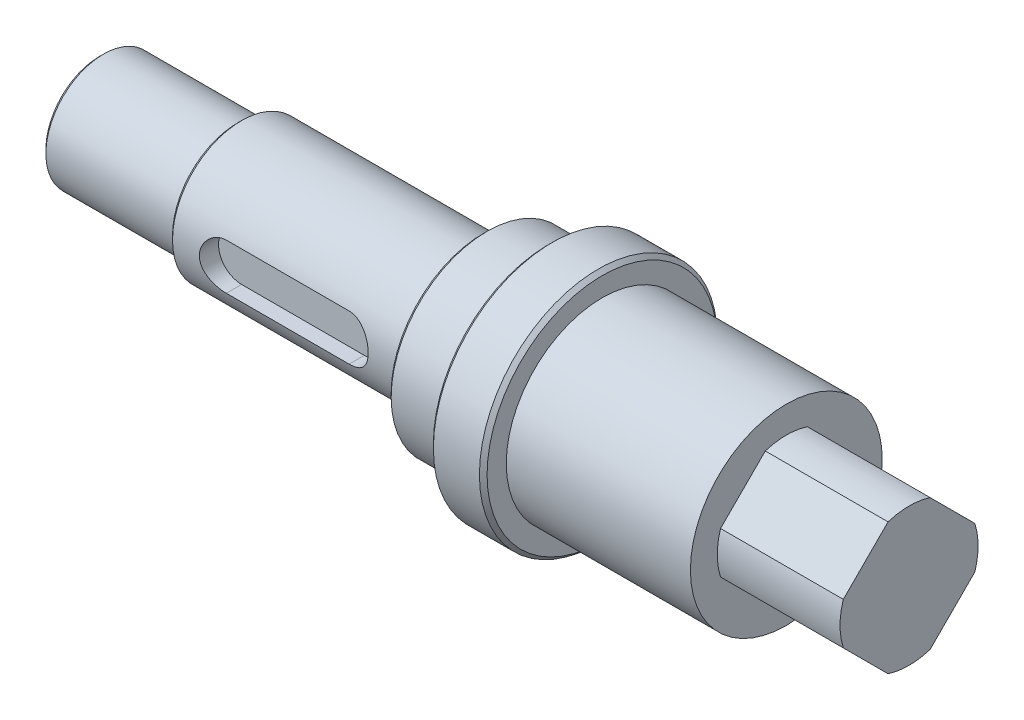
ISO-10303-21;
HEADER;
FILE_DESCRIPTION(('STEP AP214'),'2;1');
FILE_NAME('part.step','',(''),(''),'','','');
FILE_SCHEMA(('AUTOMOTIVE_DESIGN { 1 0 10303 214 1 1 1 1 }'));
ENDSEC;
DATA;
#1=APPLICATION_CONTEXT('core data for automotive mechanical design processes');
#2=APPLICATION_PROTOCOL_DEFINITION('international standard','automotive_design',2000,#1);
#3=PRODUCT_CONTEXT('',#1,'mechanical');
#4=PRODUCT('Part','Part','',(#3));
#5=PRODUCT_RELATED_PRODUCT_CATEGORY('part','',(#4));
#6=PRODUCT_DEFINITION_FORMATION('','',#4);
#7=PRODUCT_DEFINITION_CONTEXT('part definition',#1,'design');
#8=PRODUCT_DEFINITION('design','',#6,#7);
#9=PRODUCT_DEFINITION_SHAPE('','',#8);
#10=(LENGTH_UNIT() NAMED_UNIT(*) SI_UNIT(.MILLI.,.METRE.));
#11=(NAMED_UNIT(*) PLANE_ANGLE_UNIT() SI_UNIT($,.RADIAN.));
#12=(NAMED_UNIT(*) SI_UNIT($,.STERADIAN.) SOLID_ANGLE_UNIT());
#13=UNCERTAINTY_MEASURE_WITH_UNIT(LENGTH_MEASURE(1.E-05),#10,'distance_accuracy_value','');
#14=(GEOMETRIC_REPRESENTATION_CONTEXT(3) GLOBAL_UNCERTAINTY_ASSIGNED_CONTEXT((#13)) GLOBAL_UNIT_ASSIGNED_CONTEXT((#10,
#11,#12)) REPRESENTATION_CONTEXT('',''));
#15=CARTESIAN_POINT('',(0.,0.,0.));
#16=DIRECTION('',(0.,0.,1.));
#17=DIRECTION('',(1.,0.,0.));
#18=AXIS2_PLACEMENT_3D('',#15,#16,#17);
#19=CARTESIAN_POINT('',(-71.5,0.,0.));
#20=DIRECTION('',(1.,0.,0.));
#21=DIRECTION('',(0.,0.,-1.));
#22=AXIS2_PLACEMENT_3D('',#19,#20,#21);
#23=CYLINDRICAL_SURFACE('',#22,9.);
#24=CARTESIAN_POINT('',(-39.5,0.,0.));
#25=DIRECTION('',(-1.,0.,0.));
#26=DIRECTION('',(0.,0.,1.));
#27=AXIS2_PLACEMENT_3D('',#24,#25,#26);
#28=CIRCLE('',#27,9.);
#29=CARTESIAN_POINT('',(-39.5,0.,9.));
#30=VERTEX_POINT('',#29);
#31=EDGE_CURVE('E120',#30,#30,#28,.T.);
#32=ORIENTED_EDGE('',*,*,#31,.T.);
#33=EDGE_LOOP('',(#32));
#34=FACE_BOUND('',#33,.T.);
#35=CARTESIAN_POINT('',(-71.,0.,0.));
#36=DIRECTION('',(-1.,0.,0.));
#37=DIRECTION('',(0.,0.,1.));
#38=AXIS2_PLACEMENT_3D('',#35,#36,#37);
#39=CIRCLE('',#38,9.);
#40=CARTESIAN_POINT('',(-71.,0.,9.));
#41=VERTEX_POINT('',#40);
#42=EDGE_CURVE('E227',#41,#41,#39,.F.);
#43=ORIENTED_EDGE('',*,*,#42,.T.);
#44=EDGE_LOOP('',(#43));
#45=FACE_BOUND('',#44,.T.);
#46=CARTESIAN_POINT('',(-64.5,3.,8.48528137423857));
#47=CARTESIAN_POINT('',(-64.5818484933844,3.00001078932486,8.48526831927789));
#48=CARTESIAN_POINT('',(-64.6636896896105,2.99665064665902,8.48646532685483));
#49=CARTESIAN_POINT('',(-64.8267372460191,2.98327254936565,8.49118228945209));
#50=CARTESIAN_POINT('',(-64.9079437715857,2.97325639196642,8.49470161740771));
#51=CARTESIAN_POINT('',(-65.0689085860255,2.94668951307354,8.50395246303008));
#52=CARTESIAN_POINT('',(-65.148670443061,2.93015817315761,8.50967741820142));
#53=CARTESIAN_POINT('',(-65.3064099222994,2.89073017236144,8.52315143887203));
#54=CARTESIAN_POINT('',(-65.384387479908,2.86783328143241,8.53090057752397));
#55=CARTESIAN_POINT('',(-65.6147538956573,2.78989861567431,8.55683928952694));
#56=CARTESIAN_POINT('',(-65.7638149889627,2.72557700172275,8.5777349266086));
#57=CARTESIAN_POINT('',(-66.0490521737574,2.57421340927528,8.62436440905027));
#58=CARTESIAN_POINT('',(-66.1852202829412,2.4871574792233,8.65010122261301));
#59=CARTESIAN_POINT('',(-66.4461514841598,2.28915595016086,8.70463418867364));
#60=CARTESIAN_POINT('',(-66.5703421713023,2.17747541556633,8.73350627313643));
#61=CARTESIAN_POINT('',(-66.7986205239,1.93496485428978,8.79041552071284));
#62=CARTESIAN_POINT('',(-66.9027046096561,1.80413142497752,8.81845253440363));
#63=CARTESIAN_POINT('',(-67.0904378690398,1.52281106991368,8.87141647315469));
#64=CARTESIAN_POINT('',(-67.1734827690068,1.3719003033607,8.8962431223892));
#65=CARTESIAN_POINT('',(-67.3127769392054,1.05728771462316,8.9390882626048));
#66=CARTESIAN_POINT('',(-67.3690343949708,0.893589817668319,8.95710883299482));
#67=CARTESIAN_POINT('',(-67.4512071304867,0.564088045229084,8.98377213313373));
#68=CARTESIAN_POINT('',(-67.4781098013917,0.398555505085338,8.99271926928151));
#69=CARTESIAN_POINT('',(-67.5039489118423,0.0650969066624217,9.0013082524901));
#70=CARTESIAN_POINT('',(-67.5028920150987,-0.10282857176297,9.00095231678789));
#71=CARTESIAN_POINT('',(-67.4734671340687,-0.429311537733988,8.99118115872284));
#72=CARTESIAN_POINT('',(-67.4461720359939,-0.587978116884624,8.98212182877037));
#73=CARTESIAN_POINT('',(-67.3668204541081,-0.898332184121464,8.9564088159923));
#74=CARTESIAN_POINT('',(-67.3147625972955,-1.05001928471038,8.93975471206725));
#75=CARTESIAN_POINT('',(-67.1867357048648,-1.34445790368093,8.90027004455731));
#76=CARTESIAN_POINT('',(-67.1104611658558,-1.48706564697703,8.8773611217211));
#77=CARTESIAN_POINT('',(-66.9364208447953,-1.757773637242,8.82775164383326));
#78=CARTESIAN_POINT('',(-66.838649216676,-1.88586992347829,8.80105005807908));
#79=CARTESIAN_POINT('',(-66.6189841175417,-2.13029252762403,8.74518810577395));
#80=CARTESIAN_POINT('',(-66.4961729486757,-2.24578277403271,8.7159711601532));
#81=CARTESIAN_POINT('',(-66.2326859547076,-2.45481413464107,8.65942491449436));
#82=CARTESIAN_POINT('',(-66.0920043807076,-2.54834815783839,8.63209622629495));
#83=CARTESIAN_POINT('',(-65.7939199217636,-2.71201733554396,8.58210018141277));
#84=CARTESIAN_POINT('',(-65.6363008488814,-2.78178668333576,8.55950759277136));
#85=CARTESIAN_POINT('',(-65.3923158654452,-2.86551808116445,8.5316849132946));
#86=CARTESIAN_POINT('',(-65.3097432429298,-2.889939000529,8.52342263559069));
#87=CARTESIAN_POINT('',(-65.1426296037896,-2.9316254907929,8.50917513666655));
#88=CARTESIAN_POINT('',(-65.0580895046639,-2.94889432902108,8.50318887578236));
#89=CARTESIAN_POINT('',(-64.8947667222494,-2.97496555991272,8.49410161473166));
#90=CARTESIAN_POINT('',(-64.8160871393639,-2.98435073218189,8.49080270505212));
#91=CARTESIAN_POINT('',(-64.6582744704951,-2.99686829404165,8.48638843638536));
#92=CARTESIAN_POINT('',(-64.5791421023582,-3.00000875209309,8.48527025982562));
#93=CARTESIAN_POINT('',(-64.5,-3.,8.48528137423857));
#94=B_SPLINE_CURVE_WITH_KNOTS('',3,(#46,#47,#48,#49,#50,#51,#52,#53,#54,#55,#56,#57,#58,#59,#60,
#61,#62,#63,#64,#65,#66,#67,#68,#69,#70,#71,#72,#73,#74,#75,#76,#77,#78,#79,#80,#81,#82,#83,#84,
#85,#86,#87,#88,#89,#90,#91,#92,#93),.UNSPECIFIED.,.F.,.F.,(4,2,2,2,2,2,2,2,2,2,2,2,2,2,2,2,2,2,
2,2,2,2,2,4),(0.,0.245455454206308,0.490844658508407,0.735509315314908,0.980182815366522,
1.46881220307908,1.95774215958631,2.4639343690607,2.97021661609279,3.48971320817339,
4.00905095381416,4.51032334200244,5.01147626109962,5.4929717741524,5.97449398742779,
6.46234978495937,6.95033841784336,7.46126084192182,7.9723480476576,8.49098011802156,
8.75020549988897,9.0093123272696,9.24695816264697,9.48429674853611),.UNSPECIFIED.);
#95=CARTESIAN_POINT('',(-64.5,3.,8.48528137423857));
#96=VERTEX_POINT('',#95);
#97=CARTESIAN_POINT('',(-64.5,-3.,8.48528137423857));
#98=VERTEX_POINT('',#97);
#99=EDGE_CURVE('E11',#96,#98,#94,.T.);
#100=ORIENTED_EDGE('',*,*,#99,.F.);
#101=DIRECTION('',(1.,0.,0.));
#102=VECTOR('',#101,1.);
#103=CARTESIAN_POINT('',(-71.5,3.,8.48528137423857));
#104=LINE('',#103,#102);
#105=CARTESIAN_POINT('',(-48.5,3.,8.48528137423857));
#106=VERTEX_POINT('',#105);
#107=EDGE_CURVE('E239',#106,#96,#104,.F.);
#108=ORIENTED_EDGE('',*,*,#107,.F.);
#109=CARTESIAN_POINT('',(-48.5,-3.,8.48528137423857));
#110=CARTESIAN_POINT('',(-48.4181515066156,-3.00001078932487,8.48526831927788));
#111=CARTESIAN_POINT('',(-48.3363103103895,-2.99665064665902,8.48646532685483));
#112=CARTESIAN_POINT('',(-48.1732627539809,-2.98327254936565,8.49118228945209));
#113=CARTESIAN_POINT('',(-48.0920562284144,-2.97325639196643,8.49470161740771));
#114=CARTESIAN_POINT('',(-47.9310914139746,-2.94668951307355,8.50395246303008));
#115=CARTESIAN_POINT('',(-47.851329556939,-2.93015817315763,8.50967741820142));
#116=CARTESIAN_POINT('',(-47.6935900777006,-2.89073017236145,8.52315143887203));
#117=CARTESIAN_POINT('',(-47.615612520092,-2.86783328143241,8.53090057752397));
#118=CARTESIAN_POINT('',(-47.3852461043427,-2.78989861567429,8.55683928952695));
#119=CARTESIAN_POINT('',(-47.2361850110373,-2.72557700172275,8.57773492660859));
#120=CARTESIAN_POINT('',(-46.9509478262426,-2.5742134092753,8.62436440905026));
#121=CARTESIAN_POINT('',(-46.8147797170588,-2.48715747922331,8.65010122261301));
#122=CARTESIAN_POINT('',(-46.5538485158402,-2.28915595016086,8.70463418867364));
#123=CARTESIAN_POINT('',(-46.4296578286977,-2.17747541556633,8.73350627313643));
#124=CARTESIAN_POINT('',(-46.2013794761,-1.93496485428978,8.79041552071283));
#125=CARTESIAN_POINT('',(-46.0972953903439,-1.80413142497752,8.81845253440363));
#126=CARTESIAN_POINT('',(-45.9095621309602,-1.52281106991368,8.87141647315469));
#127=CARTESIAN_POINT('',(-45.8265172309932,-1.37190030336069,8.8962431223892));
#128=CARTESIAN_POINT('',(-45.6872230607945,-1.05728771462316,8.9390882626048));
#129=CARTESIAN_POINT('',(-45.6309656050292,-0.893589817668317,8.95710883299482));
#130=CARTESIAN_POINT('',(-45.5487928695132,-0.564088045229085,8.98377213313373));
#131=CARTESIAN_POINT('',(-45.5218901986083,-0.398555505085339,8.99271926928151));
#132=CARTESIAN_POINT('',(-45.4960510881577,-0.0650969066624213,9.0013082524901));
#133=CARTESIAN_POINT('',(-45.4971079849013,0.10282857176297,9.00095231678789));
#134=CARTESIAN_POINT('',(-45.5265328659313,0.429311537733991,8.99118115872284));
#135=CARTESIAN_POINT('',(-45.5538279640061,0.587978116884628,8.98212182877037));
#136=CARTESIAN_POINT('',(-45.6331795458919,0.898332184121467,8.9564088159923));
#137=CARTESIAN_POINT('',(-45.6852374027045,1.05001928471038,8.93975471206725));
#138=CARTESIAN_POINT('',(-45.8132642951352,1.34445790368095,8.9002700445573));
#139=CARTESIAN_POINT('',(-45.8895388341442,1.48706564697705,8.87736112172109));
#140=CARTESIAN_POINT('',(-46.0635791552047,1.75777363724202,8.82775164383325));
#141=CARTESIAN_POINT('',(-46.1613507833241,1.88586992347829,8.80105005807908));
#142=CARTESIAN_POINT('',(-46.3810158824584,2.13029252762403,8.74518810577395));
#143=CARTESIAN_POINT('',(-46.5038270513244,2.24578277403273,8.71597116015319));
#144=CARTESIAN_POINT('',(-46.7673140452924,2.4548141346411,8.65942491449435));
#145=CARTESIAN_POINT('',(-46.9079956192924,2.5483481578384,8.63209622629495));
#146=CARTESIAN_POINT('',(-47.2060800782364,2.71201733554396,8.58210018141277));
#147=CARTESIAN_POINT('',(-47.3636991511186,2.78178668333575,8.55950759277136));
#148=CARTESIAN_POINT('',(-47.6076841345548,2.86551808116444,8.5316849132946));
#149=CARTESIAN_POINT('',(-47.6902567570702,2.88993900052899,8.52342263559069));
#150=CARTESIAN_POINT('',(-47.8573703962103,2.93162549079289,8.50917513666655));
#151=CARTESIAN_POINT('',(-47.941910495336,2.94889432902107,8.50318887578236));
#152=CARTESIAN_POINT('',(-48.1052332777506,2.97496555991272,8.49410161473166));
#153=CARTESIAN_POINT('',(-48.1839128606361,2.98435073218189,8.49080270505212));
#154=CARTESIAN_POINT('',(-48.3417255295049,2.99686829404165,8.48638843638536));
#155=CARTESIAN_POINT('',(-48.4208578976418,3.00000875209309,8.48527025982562));
#156=CARTESIAN_POINT('',(-48.5,3.,8.48528137423857));
#157=B_SPLINE_CURVE_WITH_KNOTS('',3,(#109,#110,#111,#112,#113,#114,#115,#116,#117,#118,#119,
#120,#121,#122,#123,#124,#125,#126,#127,#128,#129,#130,#131,#132,#133,#134,#135,#136,#137,#138,
#139,#140,#141,#142,#143,#144,#145,#146,#147,#148,#149,#150,#151,#152,#153,#154,#155,#156),
.UNSPECIFIED.,.F.,.F.,(4,2,2,2,2,2,2,2,2,2,2,2,2,2,2,2,2,2,2,2,2,2,2,4),(0.,0.245455454206287,
0.490844658508364,0.735509315314858,0.980182815366429,1.46881220307905,1.9577421595863,
2.46393436906069,2.97021661609278,3.48971320817339,4.00905095381416,4.51032334200243,
5.01147626109962,5.4929717741524,5.97449398742779,6.46234978495939,6.95033841784342,
7.46126084192184,7.97234804765758,8.49098011802151,8.75020549988893,9.00931232726957,
9.24695816264694,9.48429674853609),.UNSPECIFIED.);
#158=CARTESIAN_POINT('',(-48.5,-3.,8.48528137423857));
#159=VERTEX_POINT('',#158);
#160=EDGE_CURVE('E241',#159,#106,#157,.T.);
#161=ORIENTED_EDGE('',*,*,#160,.F.);
#162=DIRECTION('',(1.,0.,0.));
#163=VECTOR('',#162,1.);
#164=CARTESIAN_POINT('',(-71.5,-3.,8.48528137423857));
#165=LINE('',#164,#163);
#166=EDGE_CURVE('E31',#98,#159,#165,.T.);
#167=ORIENTED_EDGE('',*,*,#166,.F.);
#168=EDGE_LOOP('',(#100,#108,#161,#167));
#169=FACE_BOUND('',#168,.T.);
#170=ADVANCED_FACE('F17',(#34,#45,#169),#23,.T.);
#171=CARTESIAN_POINT('',(16.,0.,0.));
#172=DIRECTION('',(-1.,0.,0.));
#173=DIRECTION('',(0.,0.,1.));
#174=AXIS2_PLACEMENT_3D('',#171,#172,#173);
#175=CYLINDRICAL_SURFACE('',#174,9.);
#176=DIRECTION('',(-1.,0.,0.));
#177=VECTOR('',#176,1.);
#178=CARTESIAN_POINT('',(16.,2.74137830206974,-8.57233019691503));
#179=LINE('',#178,#177);
#180=CARTESIAN_POINT('',(16.,2.74137830206974,-8.57233019691503));
#181=VERTEX_POINT('',#180);
#182=CARTESIAN_POINT('',(0.,2.74137830206974,-8.57233019691503));
#183=VERTEX_POINT('',#182);
#184=EDGE_CURVE('E183',#181,#183,#179,.T.);
#185=ORIENTED_EDGE('',*,*,#184,.F.);
#186=CARTESIAN_POINT('',(16.,0.,0.));
#187=DIRECTION('',(1.,0.,0.));
#188=DIRECTION('',(0.,0.,-1.));
#189=AXIS2_PLACEMENT_3D('',#186,#187,#188);
#190=CIRCLE('',#189,9.);
#191=CARTESIAN_POINT('',(16.,-2.74137830206974,-8.57233019691502));
#192=VERTEX_POINT('',#191);
#193=EDGE_CURVE('E187',#192,#181,#190,.T.);
#194=ORIENTED_EDGE('',*,*,#193,.F.);
#195=DIRECTION('',(-1.,0.,0.));
#196=VECTOR('',#195,1.);
#197=CARTESIAN_POINT('',(16.,-2.74137830206974,-8.57233019691503));
#198=LINE('',#197,#196);
#199=CARTESIAN_POINT('',(0.,-2.74137830206974,-8.57233019691503));
#200=VERTEX_POINT('',#199);
#201=EDGE_CURVE('E176',#200,#192,#198,.F.);
#202=ORIENTED_EDGE('',*,*,#201,.F.);
#203=CARTESIAN_POINT('',(0.,0.,0.));
#204=DIRECTION('',(1.,0.,0.));
#205=DIRECTION('',(0.,0.,-1.));
#206=AXIS2_PLACEMENT_3D('',#203,#204,#205);
#207=CIRCLE('',#206,9.);
#208=EDGE_CURVE('E186',#200,#183,#207,.T.);
#209=ORIENTED_EDGE('',*,*,#208,.T.);
#210=EDGE_LOOP('',(#185,#194,#202,#209));
#211=FACE_BOUND('',#210,.T.);
#212=ADVANCED_FACE('F287',(#211),#175,.T.);
#213=DIRECTION('',(-1.,0.,0.));
#214=VECTOR('',#213,1.);
#215=CARTESIAN_POINT('',(16.,8.57233019691503,-2.74137830206974));
#216=LINE('',#215,#214);
#217=CARTESIAN_POINT('',(0.,8.57233019691503,-2.74137830206974));
#218=VERTEX_POINT('',#217);
#219=CARTESIAN_POINT('',(16.,8.57233019691503,-2.74137830206974));
#220=VERTEX_POINT('',#219);
#221=EDGE_CURVE('E181',#218,#220,#216,.F.);
#222=ORIENTED_EDGE('',*,*,#221,.F.);
#223=CARTESIAN_POINT('',(0.,8.57233019691503,2.74137830206974));
#224=VERTEX_POINT('',#223);
#225=EDGE_CURVE('E46',#218,#224,#207,.T.);
#226=ORIENTED_EDGE('',*,*,#225,.T.);
#227=DIRECTION('',(-1.,0.,0.));
#228=VECTOR('',#227,1.);
#229=CARTESIAN_POINT('',(16.,8.57233019691503,2.74137830206974));
#230=LINE('',#229,#228);
#231=CARTESIAN_POINT('',(16.,8.57233019691503,2.74137830206974));
#232=VERTEX_POINT('',#231);
#233=EDGE_CURVE('E168',#232,#224,#230,.T.);
#234=ORIENTED_EDGE('',*,*,#233,.F.);
#235=EDGE_CURVE('E191',#220,#232,#190,.T.);
#236=ORIENTED_EDGE('',*,*,#235,.F.);
#237=EDGE_LOOP('',(#222,#226,#234,#236));
#238=FACE_BOUND('',#237,.T.);
#239=ADVANCED_FACE('F293',(#238),#175,.T.);
#240=DIRECTION('',(-1.,0.,0.));
#241=VECTOR('',#240,1.);
#242=CARTESIAN_POINT('',(16.,-8.57233019691503,-2.74137830206974));
#243=LINE('',#242,#241);
#244=CARTESIAN_POINT('',(16.,-8.57233019691503,-2.74137830206974));
#245=VERTEX_POINT('',#244);
#246=CARTESIAN_POINT('',(0.,-8.57233019691503,-2.74137830206974));
#247=VERTEX_POINT('',#246);
#248=EDGE_CURVE('E178',#245,#247,#243,.T.);
#249=ORIENTED_EDGE('',*,*,#248,.F.);
#250=CARTESIAN_POINT('',(16.,-8.57233019691503,2.74137830206973));
#251=VERTEX_POINT('',#250);
#252=EDGE_CURVE('E190',#251,#245,#190,.T.);
#253=ORIENTED_EDGE('',*,*,#252,.F.);
#254=DIRECTION('',(-1.,0.,0.));
#255=VECTOR('',#254,1.);
#256=CARTESIAN_POINT('',(16.,-8.57233019691503,2.74137830206973));
#257=LINE('',#256,#255);
#258=CARTESIAN_POINT('',(0.,-8.57233019691503,2.74137830206973));
#259=VERTEX_POINT('',#258);
#260=EDGE_CURVE('E171',#259,#251,#257,.F.);
#261=ORIENTED_EDGE('',*,*,#260,.F.);
#262=EDGE_CURVE('E194',#259,#247,#207,.T.);
#263=ORIENTED_EDGE('',*,*,#262,.T.);
#264=EDGE_LOOP('',(#249,#253,#261,#263));
#265=FACE_BOUND('',#264,.T.);
#266=ADVANCED_FACE('F524',(#265),#175,.T.);
#267=DIRECTION('',(-1.,0.,0.));
#268=VECTOR('',#267,1.);
#269=CARTESIAN_POINT('',(16.,-2.74137830206974,8.57233019691503));
#270=LINE('',#269,#268);
#271=CARTESIAN_POINT('',(16.,-2.74137830206974,8.57233019691503));
#272=VERTEX_POINT('',#271);
#273=CARTESIAN_POINT('',(0.,-2.74137830206974,8.57233019691503));
#274=VERTEX_POINT('',#273);
#275=EDGE_CURVE('E173',#272,#274,#270,.T.);
#276=ORIENTED_EDGE('',*,*,#275,.F.);
#277=CARTESIAN_POINT('',(16.,2.74137830206974,8.57233019691503));
#278=VERTEX_POINT('',#277);
#279=EDGE_CURVE('E575',#278,#272,#190,.T.);
#280=ORIENTED_EDGE('',*,*,#279,.F.);
#281=DIRECTION('',(-1.,0.,0.));
#282=VECTOR('',#281,1.);
#283=CARTESIAN_POINT('',(16.,2.74137830206974,8.57233019691503));
#284=LINE('',#283,#282);
#285=CARTESIAN_POINT('',(0.,2.74137830206974,8.57233019691503));
#286=VERTEX_POINT('',#285);
#287=EDGE_CURVE('E166',#286,#278,#284,.F.);
#288=ORIENTED_EDGE('',*,*,#287,.F.);
#289=EDGE_CURVE('E569',#286,#274,#207,.T.);
#290=ORIENTED_EDGE('',*,*,#289,.T.);
#291=EDGE_LOOP('',(#276,#280,#288,#290));
#292=FACE_BOUND('',#291,.T.);
#293=ADVANCED_FACE('F296',(#292),#175,.T.);
#294=CARTESIAN_POINT('',(16.,0.,0.));
#295=DIRECTION('',(1.,0.,0.));
#296=DIRECTION('',(0.,0.,-1.));
#297=AXIS2_PLACEMENT_3D('',#294,#295,#296);
#298=PLANE('',#297);
#299=ORIENTED_EDGE('',*,*,#193,.T.);
#300=DIRECTION('',(0.,0.707106781186548,0.707106781186548));
#301=VECTOR('',#300,1.);
#302=CARTESIAN_POINT('',(16.,0.,-11.3137084989848));
#303=LINE('',#302,#301);
#304=EDGE_CURVE('E152',#181,#220,#303,.T.);
#305=ORIENTED_EDGE('',*,*,#304,.T.);
#306=ORIENTED_EDGE('',*,*,#235,.T.);
#307=DIRECTION('',(0.,-0.707106781186548,0.707106781186548));
#308=VECTOR('',#307,1.);
#309=CARTESIAN_POINT('',(16.,11.3137084989848,0.));
#310=LINE('',#309,#308);
#311=EDGE_CURVE('E157',#232,#278,#310,.T.);
#312=ORIENTED_EDGE('',*,*,#311,.T.);
#313=ORIENTED_EDGE('',*,*,#279,.T.);
#314=DIRECTION('',(0.,-0.707106781186548,-0.707106781186548));
#315=VECTOR('',#314,1.);
#316=CARTESIAN_POINT('',(16.,0.,11.3137084989848));
#317=LINE('',#316,#315);
#318=EDGE_CURVE('E160',#272,#251,#317,.T.);
#319=ORIENTED_EDGE('',*,*,#318,.T.);
#320=ORIENTED_EDGE('',*,*,#252,.T.);
#321=DIRECTION('',(0.,0.707106781186548,-0.707106781186548));
#322=VECTOR('',#321,1.);
#323=CARTESIAN_POINT('',(16.,-11.3137084989848,0.));
#324=LINE('',#323,#322);
#325=EDGE_CURVE('E163',#245,#192,#324,.T.);
#326=ORIENTED_EDGE('',*,*,#325,.T.);
#327=EDGE_LOOP('',(#299,#305,#306,#312,#313,#319,#320,#326));
#328=FACE_BOUND('',#327,.T.);
#329=ADVANCED_FACE('F504',(#328),#298,.T.);
#330=CARTESIAN_POINT('',(0.,11.3137084989848,0.));
#331=DIRECTION('',(0.,0.707106781186548,0.707106781186548));
#332=DIRECTION('',(0.,-0.707106781186548,0.707106781186548));
#333=AXIS2_PLACEMENT_3D('',#330,#331,#332);
#334=PLANE('',#333);
#335=ORIENTED_EDGE('',*,*,#233,.T.);
#336=DIRECTION('',(0.,-0.707106781186548,0.707106781186548));
#337=VECTOR('',#336,1.);
#338=CARTESIAN_POINT('',(0.,5.65685424949238,5.65685424949238));
#339=LINE('',#338,#337);
#340=EDGE_CURVE('E195',#224,#286,#339,.T.);
#341=ORIENTED_EDGE('',*,*,#340,.T.);
#342=ORIENTED_EDGE('',*,*,#287,.T.);
#343=ORIENTED_EDGE('',*,*,#311,.F.);
#344=EDGE_LOOP('',(#335,#341,#342,#343));
#345=FACE_BOUND('',#344,.T.);
#346=ADVANCED_FACE('F494',(#345),#334,.T.);
#347=CARTESIAN_POINT('',(0.,0.,11.3137084989848));
#348=DIRECTION('',(0.,-0.707106781186548,0.707106781186548));
#349=DIRECTION('',(0.,-0.707106781186548,-0.707106781186548));
#350=AXIS2_PLACEMENT_3D('',#347,#348,#349);
#351=PLANE('',#350);
#352=ORIENTED_EDGE('',*,*,#275,.T.);
#353=DIRECTION('',(0.,-0.707106781186548,-0.707106781186548));
#354=VECTOR('',#353,1.);
#355=CARTESIAN_POINT('',(0.,-5.65685424949238,5.65685424949238));
#356=LINE('',#355,#354);
#357=EDGE_CURVE('E198',#274,#259,#356,.T.);
#358=ORIENTED_EDGE('',*,*,#357,.T.);
#359=ORIENTED_EDGE('',*,*,#260,.T.);
#360=ORIENTED_EDGE('',*,*,#318,.F.);
#361=EDGE_LOOP('',(#352,#358,#359,#360));
#362=FACE_BOUND('',#361,.T.);
#363=ADVANCED_FACE('F484',(#362),#351,.T.);
#364=CARTESIAN_POINT('',(0.,-11.3137084989848,0.));
#365=DIRECTION('',(0.,-0.707106781186548,-0.707106781186548));
#366=DIRECTION('',(0.,0.707106781186548,-0.707106781186548));
#367=AXIS2_PLACEMENT_3D('',#364,#365,#366);
#368=PLANE('',#367);
#369=ORIENTED_EDGE('',*,*,#248,.T.);
#370=DIRECTION('',(0.,0.707106781186548,-0.707106781186548));
#371=VECTOR('',#370,1.);
#372=CARTESIAN_POINT('',(0.,-5.65685424949238,-5.65685424949238));
#373=LINE('',#372,#371);
#374=EDGE_CURVE('E201',#247,#200,#373,.T.);
#375=ORIENTED_EDGE('',*,*,#374,.T.);
#376=ORIENTED_EDGE('',*,*,#201,.T.);
#377=ORIENTED_EDGE('',*,*,#325,.F.);
#378=EDGE_LOOP('',(#369,#375,#376,#377));
#379=FACE_BOUND('',#378,.T.);
#380=ADVANCED_FACE('F474',(#379),#368,.T.);
#381=CARTESIAN_POINT('',(0.,0.,-11.3137084989848));
#382=DIRECTION('',(0.,0.707106781186548,-0.707106781186548));
#383=DIRECTION('',(0.,0.707106781186548,0.707106781186548));
#384=AXIS2_PLACEMENT_3D('',#381,#382,#383);
#385=PLANE('',#384);
#386=ORIENTED_EDGE('',*,*,#184,.T.);
#387=DIRECTION('',(0.,0.707106781186548,0.707106781186548));
#388=VECTOR('',#387,1.);
#389=CARTESIAN_POINT('',(0.,5.65685424949238,-5.65685424949238));
#390=LINE('',#389,#388);
#391=EDGE_CURVE('E204',#183,#218,#390,.T.);
#392=ORIENTED_EDGE('',*,*,#391,.T.);
#393=ORIENTED_EDGE('',*,*,#221,.T.);
#394=ORIENTED_EDGE('',*,*,#304,.F.);
#395=EDGE_LOOP('',(#386,#392,#393,#394));
#396=FACE_BOUND('',#395,.T.);
#397=ADVANCED_FACE('F464',(#396),#385,.T.);
#398=CARTESIAN_POINT('',(-24.,0.,0.));
#399=DIRECTION('',(1.,0.,0.));
#400=DIRECTION('',(0.,0.,-1.));
#401=AXIS2_PLACEMENT_3D('',#398,#399,#400);
#402=CYLINDRICAL_SURFACE('',#401,12.5);
#403=CARTESIAN_POINT('',(-24.,0.,0.));
#404=DIRECTION('',(-1.,0.,0.));
#405=DIRECTION('',(0.,0.,1.));
#406=AXIS2_PLACEMENT_3D('',#403,#404,#405);
#407=CIRCLE('',#406,12.5);
#408=CARTESIAN_POINT('',(-24.,0.,12.5));
#409=VERTEX_POINT('',#408);
#410=EDGE_CURVE('E149',#409,#409,#407,.T.);
#411=ORIENTED_EDGE('',*,*,#410,.F.);
#412=EDGE_LOOP('',(#411));
#413=FACE_BOUND('',#412,.T.);
#414=CARTESIAN_POINT('',(0.,0.,0.));
#415=DIRECTION('',(-1.,0.,0.));
#416=DIRECTION('',(0.,0.,1.));
#417=AXIS2_PLACEMENT_3D('',#414,#415,#416);
#418=CIRCLE('',#417,12.5);
#419=CARTESIAN_POINT('',(0.,0.,12.5));
#420=VERTEX_POINT('',#419);
#421=EDGE_CURVE('E148',#420,#420,#418,.T.);
#422=ORIENTED_EDGE('',*,*,#421,.T.);
#423=EDGE_LOOP('',(#422));
#424=FACE_BOUND('',#423,.T.);
#425=ADVANCED_FACE('F455',(#413,#424),#402,.T.);
#426=CARTESIAN_POINT('',(0.,0.,0.));
#427=DIRECTION('',(-1.,0.,0.));
#428=DIRECTION('',(0.,0.,1.));
#429=AXIS2_PLACEMENT_3D('',#426,#427,#428);
#430=PLANE('',#429);
#431=ORIENTED_EDGE('',*,*,#357,.F.);
#432=ORIENTED_EDGE('',*,*,#289,.F.);
#433=ORIENTED_EDGE('',*,*,#340,.F.);
#434=ORIENTED_EDGE('',*,*,#225,.F.);
#435=ORIENTED_EDGE('',*,*,#391,.F.);
#436=ORIENTED_EDGE('',*,*,#208,.F.);
#437=ORIENTED_EDGE('',*,*,#374,.F.);
#438=ORIENTED_EDGE('',*,*,#262,.F.);
#439=EDGE_LOOP('',(#431,#432,#433,#434,#435,#436,#437,#438));
#440=FACE_BOUND('',#439,.T.);
#441=ORIENTED_EDGE('',*,*,#421,.F.);
#442=EDGE_LOOP('',(#441));
#443=FACE_BOUND('',#442,.T.);
#444=ADVANCED_FACE('F445',(#440,#443),#430,.F.);
#445=CARTESIAN_POINT('',(-31.,0.,0.));
#446=DIRECTION('',(1.,0.,0.));
#447=DIRECTION('',(0.,0.,-1.));
#448=AXIS2_PLACEMENT_3D('',#445,#446,#447);
#449=CYLINDRICAL_SURFACE('',#448,15.5);
#450=CARTESIAN_POINT('',(-24.5,0.,0.));
#451=DIRECTION('',(-1.,0.,0.));
#452=DIRECTION('',(0.,0.,1.));
#453=AXIS2_PLACEMENT_3D('',#450,#451,#452);
#454=CIRCLE('',#453,15.5);
#455=CARTESIAN_POINT('',(-24.5,0.,15.5));
#456=VERTEX_POINT('',#455);
#457=EDGE_CURVE('E209',#456,#456,#454,.T.);
#458=ORIENTED_EDGE('',*,*,#457,.T.);
#459=EDGE_LOOP('',(#458));
#460=FACE_BOUND('',#459,.T.);
#461=CARTESIAN_POINT('',(-30.5,0.,0.));
#462=DIRECTION('',(-1.,0.,0.));
#463=DIRECTION('',(0.,0.,1.));
#464=AXIS2_PLACEMENT_3D('',#461,#462,#463);
#465=CIRCLE('',#464,15.5);
#466=CARTESIAN_POINT('',(-30.5,0.,15.5));
#467=VERTEX_POINT('',#466);
#468=EDGE_CURVE('E206',#467,#467,#465,.F.);
#469=ORIENTED_EDGE('',*,*,#468,.T.);
#470=EDGE_LOOP('',(#469));
#471=FACE_BOUND('',#470,.T.);
#472=ADVANCED_FACE('F435',(#460,#471),#449,.T.);
#473=CARTESIAN_POINT('',(-31.,0.,0.));
#474=DIRECTION('',(-1.,0.,0.));
#475=DIRECTION('',(0.,0.,1.));
#476=AXIS2_PLACEMENT_3D('',#473,#474,#475);
#477=PLANE('',#476);
#478=CARTESIAN_POINT('',(-31.,0.,0.));
#479=DIRECTION('',(-1.,0.,0.));
#480=DIRECTION('',(0.,0.,1.));
#481=AXIS2_PLACEMENT_3D('',#478,#479,#480);
#482=CIRCLE('',#481,12.5);
#483=CARTESIAN_POINT('',(-31.,0.,12.5));
#484=VERTEX_POINT('',#483);
#485=EDGE_CURVE('E145',#484,#484,#482,.T.);
#486=ORIENTED_EDGE('',*,*,#485,.F.);
#487=EDGE_LOOP('',(#486));
#488=FACE_BOUND('',#487,.T.);
#489=CARTESIAN_POINT('',(-31.,0.,0.));
#490=DIRECTION('',(-1.,0.,0.));
#491=DIRECTION('',(0.,0.,1.));
#492=AXIS2_PLACEMENT_3D('',#489,#490,#491);
#493=CIRCLE('',#492,15.);
#494=CARTESIAN_POINT('',(-31.,0.,15.));
#495=VERTEX_POINT('',#494);
#496=EDGE_CURVE('E215',#495,#495,#493,.T.);
#497=ORIENTED_EDGE('',*,*,#496,.T.);
#498=EDGE_LOOP('',(#497));
#499=FACE_BOUND('',#498,.T.);
#500=ADVANCED_FACE('F425',(#488,#499),#477,.T.);
#501=CARTESIAN_POINT('',(-24.,0.,0.));
#502=DIRECTION('',(-1.,0.,0.));
#503=DIRECTION('',(0.,0.,1.));
#504=AXIS2_PLACEMENT_3D('',#501,#502,#503);
#505=PLANE('',#504);
#506=CARTESIAN_POINT('',(-24.,0.,0.));
#507=DIRECTION('',(-1.,0.,0.));
#508=DIRECTION('',(0.,0.,1.));
#509=AXIS2_PLACEMENT_3D('',#506,#507,#508);
#510=CIRCLE('',#509,15.);
#511=CARTESIAN_POINT('',(-24.,0.,15.));
#512=VERTEX_POINT('',#511);
#513=EDGE_CURVE('E212',#512,#512,#510,.F.);
#514=ORIENTED_EDGE('',*,*,#513,.T.);
#515=EDGE_LOOP('',(#514));
#516=FACE_BOUND('',#515,.T.);
#517=ORIENTED_EDGE('',*,*,#410,.T.);
#518=EDGE_LOOP('',(#517));
#519=FACE_BOUND('',#518,.T.);
#520=ADVANCED_FACE('F415',(#516,#519),#505,.F.);
#521=CARTESIAN_POINT('',(-24.5,0.,0.));
#522=DIRECTION('',(-1.,0.,0.));
#523=DIRECTION('',(0.,0.,1.));
#524=AXIS2_PLACEMENT_3D('',#521,#522,#523);
#525=CONICAL_SURFACE('',#524,15.5,0.785398163397459);
#526=ORIENTED_EDGE('',*,*,#513,.F.);
#527=EDGE_LOOP('',(#526));
#528=FACE_BOUND('',#527,.T.);
#529=ORIENTED_EDGE('',*,*,#457,.F.);
#530=EDGE_LOOP('',(#529));
#531=FACE_BOUND('',#530,.T.);
#532=ADVANCED_FACE('F405',(#528,#531),#525,.T.);
#533=CARTESIAN_POINT('',(-31.,0.,0.));
#534=DIRECTION('',(1.,0.,0.));
#535=DIRECTION('',(0.,0.,-1.));
#536=AXIS2_PLACEMENT_3D('',#533,#534,#535);
#537=CONICAL_SURFACE('',#536,15.,0.785398163397442);
#538=ORIENTED_EDGE('',*,*,#468,.F.);
#539=EDGE_LOOP('',(#538));
#540=FACE_BOUND('',#539,.T.);
#541=ORIENTED_EDGE('',*,*,#496,.F.);
#542=EDGE_LOOP('',(#541));
#543=FACE_BOUND('',#542,.T.);
#544=ADVANCED_FACE('F395',(#540,#543),#537,.T.);
#545=CARTESIAN_POINT('',(-39.5,0.,0.));
#546=DIRECTION('',(1.,0.,0.));
#547=DIRECTION('',(0.,0.,-1.));
#548=AXIS2_PLACEMENT_3D('',#545,#546,#547);
#549=CYLINDRICAL_SURFACE('',#548,12.5);
#550=CARTESIAN_POINT('',(-39.,0.,0.));
#551=DIRECTION('',(-1.,0.,0.));
#552=DIRECTION('',(0.,0.,1.));
#553=AXIS2_PLACEMENT_3D('',#550,#551,#552);
#554=CIRCLE('',#553,12.5);
#555=CARTESIAN_POINT('',(-39.,0.,12.5));
#556=VERTEX_POINT('',#555);
#557=EDGE_CURVE('E221',#556,#556,#554,.F.);
#558=ORIENTED_EDGE('',*,*,#557,.T.);
#559=EDGE_LOOP('',(#558));
#560=FACE_BOUND('',#559,.T.);
#561=ORIENTED_EDGE('',*,*,#485,.T.);
#562=EDGE_LOOP('',(#561));
#563=FACE_BOUND('',#562,.T.);
#564=ADVANCED_FACE('F386',(#560,#563),#549,.T.);
#565=CARTESIAN_POINT('',(-39.5,0.,0.));
#566=DIRECTION('',(-1.,0.,0.));
#567=DIRECTION('',(0.,0.,1.));
#568=AXIS2_PLACEMENT_3D('',#565,#566,#567);
#569=PLANE('',#568);
#570=ORIENTED_EDGE('',*,*,#31,.F.);
#571=EDGE_LOOP('',(#570));
#572=FACE_BOUND('',#571,.T.);
#573=CARTESIAN_POINT('',(-39.5,0.,0.));
#574=DIRECTION('',(-1.,0.,0.));
#575=DIRECTION('',(0.,0.,1.));
#576=AXIS2_PLACEMENT_3D('',#573,#574,#575);
#577=CIRCLE('',#576,12.);
#578=CARTESIAN_POINT('',(-39.5,0.,12.));
#579=VERTEX_POINT('',#578);
#580=EDGE_CURVE('E218',#579,#579,#577,.T.);
#581=ORIENTED_EDGE('',*,*,#580,.T.);
#582=EDGE_LOOP('',(#581));
#583=FACE_BOUND('',#582,.T.);
#584=ADVANCED_FACE('F281',(#572,#583),#569,.T.);
#585=CARTESIAN_POINT('',(-39.5,0.,0.));
#586=DIRECTION('',(1.,0.,0.));
#587=DIRECTION('',(0.,0.,-1.));
#588=AXIS2_PLACEMENT_3D('',#585,#586,#587);
#589=CONICAL_SURFACE('',#588,12.,0.785398163397452);
#590=ORIENTED_EDGE('',*,*,#557,.F.);
#591=EDGE_LOOP('',(#590));
#592=FACE_BOUND('',#591,.T.);
#593=ORIENTED_EDGE('',*,*,#580,.F.);
#594=EDGE_LOOP('',(#593));
#595=FACE_BOUND('',#594,.T.);
#596=ADVANCED_FACE('F272',(#592,#595),#589,.T.);
#597=CARTESIAN_POINT('',(-71.5,0.,0.));
#598=DIRECTION('',(-1.,0.,0.));
#599=DIRECTION('',(0.,0.,1.));
#600=AXIS2_PLACEMENT_3D('',#597,#598,#599);
#601=PLANE('',#600);
#602=CARTESIAN_POINT('',(-71.5,0.,0.));
#603=DIRECTION('',(-1.,0.,0.));
#604=DIRECTION('',(0.,0.,1.));
#605=AXIS2_PLACEMENT_3D('',#602,#603,#604);
#606=CIRCLE('',#605,7.5);
#607=CARTESIAN_POINT('',(-71.5,0.,7.5));
#608=VERTEX_POINT('',#607);
#609=EDGE_CURVE('E230',#608,#608,#606,.T.);
#610=ORIENTED_EDGE('',*,*,#609,.F.);
#611=EDGE_LOOP('',(#610));
#612=FACE_BOUND('',#611,.T.);
#613=CARTESIAN_POINT('',(-71.5,0.,0.));
#614=DIRECTION('',(-1.,0.,0.));
#615=DIRECTION('',(0.,0.,1.));
#616=AXIS2_PLACEMENT_3D('',#613,#614,#615);
#617=CIRCLE('',#616,8.5);
#618=CARTESIAN_POINT('',(-71.5,0.,8.5));
#619=VERTEX_POINT('',#618);
#620=EDGE_CURVE('E224',#619,#619,#617,.T.);
#621=ORIENTED_EDGE('',*,*,#620,.T.);
#622=EDGE_LOOP('',(#621));
#623=FACE_BOUND('',#622,.T.);
#624=ADVANCED_FACE('F270',(#612,#623),#601,.T.);
#625=CARTESIAN_POINT('',(-71.5,0.,0.));
#626=DIRECTION('',(1.,0.,0.));
#627=DIRECTION('',(0.,0.,-1.));
#628=AXIS2_PLACEMENT_3D('',#625,#626,#627);
#629=CONICAL_SURFACE('',#628,8.5,0.785398163397439);
#630=ORIENTED_EDGE('',*,*,#42,.F.);
#631=EDGE_LOOP('',(#630));
#632=FACE_BOUND('',#631,.T.);
#633=ORIENTED_EDGE('',*,*,#620,.F.);
#634=EDGE_LOOP('',(#633));
#635=FACE_BOUND('',#634,.T.);
#636=ADVANCED_FACE('F268',(#632,#635),#629,.T.);
#637=CARTESIAN_POINT('',(-89.5,0.,0.));
#638=DIRECTION('',(1.,0.,0.));
#639=DIRECTION('',(0.,0.,-1.));
#640=AXIS2_PLACEMENT_3D('',#637,#638,#639);
#641=CYLINDRICAL_SURFACE('',#640,7.5);
#642=CARTESIAN_POINT('',(-89.,0.,0.));
#643=DIRECTION('',(1.,0.,0.));
#644=DIRECTION('',(0.,0.,-1.));
#645=AXIS2_PLACEMENT_3D('',#642,#643,#644);
#646=CIRCLE('',#645,7.5);
#647=CARTESIAN_POINT('',(-89.,0.,-7.5));
#648=VERTEX_POINT('',#647);
#649=EDGE_CURVE('E233',#648,#648,#646,.T.);
#650=ORIENTED_EDGE('',*,*,#649,.T.);
#651=EDGE_LOOP('',(#650));
#652=FACE_BOUND('',#651,.T.);
#653=ORIENTED_EDGE('',*,*,#609,.T.);
#654=EDGE_LOOP('',(#653));
#655=FACE_BOUND('',#654,.T.);
#656=ADVANCED_FACE('F265',(#652,#655),#641,.T.);
#657=CARTESIAN_POINT('',(-89.5,0.,0.));
#658=DIRECTION('',(1.,0.,0.));
#659=DIRECTION('',(0.,0.,-1.));
#660=AXIS2_PLACEMENT_3D('',#657,#658,#659);
#661=PLANE('',#660);
#662=CARTESIAN_POINT('',(-89.5,0.,0.));
#663=DIRECTION('',(1.,0.,0.));
#664=DIRECTION('',(0.,0.,-1.));
#665=AXIS2_PLACEMENT_3D('',#662,#663,#664);
#666=CIRCLE('',#665,7.);
#667=CARTESIAN_POINT('',(-89.5,0.,-7.));
#668=VERTEX_POINT('',#667);
#669=EDGE_CURVE('E236',#668,#668,#666,.F.);
#670=ORIENTED_EDGE('',*,*,#669,.T.);
#671=EDGE_LOOP('',(#670));
#672=FACE_BOUND('',#671,.T.);
#673=ADVANCED_FACE('F262',(#672),#661,.F.);
#674=CARTESIAN_POINT('',(-89.,0.,0.));
#675=DIRECTION('',(1.,0.,0.));
#676=DIRECTION('',(0.,0.,-1.));
#677=AXIS2_PLACEMENT_3D('',#674,#675,#676);
#678=CONICAL_SURFACE('',#677,7.5,0.785398163397442);
#679=ORIENTED_EDGE('',*,*,#669,.F.);
#680=EDGE_LOOP('',(#679));
#681=FACE_BOUND('',#680,.T.);
#682=ORIENTED_EDGE('',*,*,#649,.F.);
#683=EDGE_LOOP('',(#682));
#684=FACE_BOUND('',#683,.T.);
#685=ADVANCED_FACE('F19',(#681,#684),#678,.T.);
#686=CARTESIAN_POINT('',(-64.5,0.,112.));
#687=DIRECTION('',(0.,0.,-1.));
#688=DIRECTION('',(-1.,0.,0.));
#689=AXIS2_PLACEMENT_3D('',#686,#687,#688);
#690=CYLINDRICAL_SURFACE('',#689,3.);
#691=ORIENTED_EDGE('',*,*,#99,.T.);
#692=DIRECTION('',(0.,0.,-1.));
#693=VECTOR('',#692,1.);
#694=CARTESIAN_POINT('',(-64.5,-3.,112.));
#695=LINE('',#694,#693);
#696=CARTESIAN_POINT('',(-64.5,-3.,6.5));
#697=VERTEX_POINT('',#696);
#698=EDGE_CURVE('E111',#98,#697,#695,.T.);
#699=ORIENTED_EDGE('',*,*,#698,.T.);
#700=CARTESIAN_POINT('',(-64.5,0.,6.5));
#701=DIRECTION('',(0.,0.,1.));
#702=DIRECTION('',(1.,0.,0.));
#703=AXIS2_PLACEMENT_3D('',#700,#701,#702);
#704=CIRCLE('',#703,3.);
#705=CARTESIAN_POINT('',(-64.5,3.,6.5));
#706=VERTEX_POINT('',#705);
#707=EDGE_CURVE('E116',#706,#697,#704,.T.);
#708=ORIENTED_EDGE('',*,*,#707,.F.);
#709=DIRECTION('',(0.,0.,-1.));
#710=VECTOR('',#709,1.);
#711=CARTESIAN_POINT('',(-64.5,3.,112.));
#712=LINE('',#711,#710);
#713=EDGE_CURVE('E139',#96,#706,#712,.T.);
#714=ORIENTED_EDGE('',*,*,#713,.F.);
#715=EDGE_LOOP('',(#691,#699,#708,#714));
#716=FACE_BOUND('',#715,.T.);
#717=ADVANCED_FACE('F113',(#716),#690,.F.);
#718=CARTESIAN_POINT('',(-64.5,-3.,112.));
#719=DIRECTION('',(0.,1.,0.));
#720=DIRECTION('',(0.,0.,1.));
#721=AXIS2_PLACEMENT_3D('',#718,#719,#720);
#722=PLANE('',#721);
#723=ORIENTED_EDGE('',*,*,#166,.T.);
#724=DIRECTION('',(0.,0.,-1.));
#725=VECTOR('',#724,1.);
#726=CARTESIAN_POINT('',(-48.5,-3.,112.));
#727=LINE('',#726,#725);
#728=CARTESIAN_POINT('',(-48.5,-3.,6.5));
#729=VERTEX_POINT('',#728);
#730=EDGE_CURVE('E121',#159,#729,#727,.T.);
#731=ORIENTED_EDGE('',*,*,#730,.T.);
#732=DIRECTION('',(1.,0.,0.));
#733=VECTOR('',#732,1.);
#734=CARTESIAN_POINT('',(-64.5,-3.,6.5));
#735=LINE('',#734,#733);
#736=EDGE_CURVE('E124',#697,#729,#735,.T.);
#737=ORIENTED_EDGE('',*,*,#736,.F.);
#738=ORIENTED_EDGE('',*,*,#698,.F.);
#739=EDGE_LOOP('',(#723,#731,#737,#738));
#740=FACE_BOUND('',#739,.T.);
#741=ADVANCED_FACE('F125',(#740),#722,.T.);
#742=CARTESIAN_POINT('',(-48.5,0.,112.));
#743=DIRECTION('',(0.,0.,-1.));
#744=DIRECTION('',(-1.,0.,0.));
#745=AXIS2_PLACEMENT_3D('',#742,#743,#744);
#746=CYLINDRICAL_SURFACE('',#745,3.);
#747=ORIENTED_EDGE('',*,*,#160,.T.);
#748=DIRECTION('',(0.,0.,-1.));
#749=VECTOR('',#748,1.);
#750=CARTESIAN_POINT('',(-48.5,3.,112.));
#751=LINE('',#750,#749);
#752=CARTESIAN_POINT('',(-48.5,3.,6.5));
#753=VERTEX_POINT('',#752);
#754=EDGE_CURVE('E38',#106,#753,#751,.T.);
#755=ORIENTED_EDGE('',*,*,#754,.T.);
#756=CARTESIAN_POINT('',(-48.5,0.,6.5));
#757=DIRECTION('',(0.,0.,1.));
#758=DIRECTION('',(1.,0.,0.));
#759=AXIS2_PLACEMENT_3D('',#756,#757,#758);
#760=CIRCLE('',#759,3.);
#761=EDGE_CURVE('E130',#729,#753,#760,.T.);
#762=ORIENTED_EDGE('',*,*,#761,.F.);
#763=ORIENTED_EDGE('',*,*,#730,.F.);
#764=EDGE_LOOP('',(#747,#755,#762,#763));
#765=FACE_BOUND('',#764,.T.);
#766=ADVANCED_FACE('F250',(#765),#746,.F.);
#767=CARTESIAN_POINT('',(-64.5,3.,112.));
#768=DIRECTION('',(0.,-1.,0.));
#769=DIRECTION('',(0.,0.,-1.));
#770=AXIS2_PLACEMENT_3D('',#767,#768,#769);
#771=PLANE('',#770);
#772=ORIENTED_EDGE('',*,*,#107,.T.);
#773=ORIENTED_EDGE('',*,*,#713,.T.);
#774=DIRECTION('',(-1.,0.,0.));
#775=VECTOR('',#774,1.);
#776=CARTESIAN_POINT('',(-64.5,3.,6.5));
#777=LINE('',#776,#775);
#778=EDGE_CURVE('E134',#753,#706,#777,.T.);
#779=ORIENTED_EDGE('',*,*,#778,.F.);
#780=ORIENTED_EDGE('',*,*,#754,.F.);
#781=EDGE_LOOP('',(#772,#773,#779,#780));
#782=FACE_BOUND('',#781,.T.);
#783=ADVANCED_FACE('F255',(#782),#771,.T.);
#784=CARTESIAN_POINT('',(-64.5,0.,6.5));
#785=DIRECTION('',(0.,0.,1.));
#786=DIRECTION('',(1.,0.,0.));
#787=AXIS2_PLACEMENT_3D('',#784,#785,#786);
#788=PLANE('',#787);
#789=ORIENTED_EDGE('',*,*,#707,.T.);
#790=ORIENTED_EDGE('',*,*,#736,.T.);
#791=ORIENTED_EDGE('',*,*,#761,.T.);
#792=ORIENTED_EDGE('',*,*,#778,.T.);
#793=EDGE_LOOP('',(#789,#790,#791,#792));
#794=FACE_BOUND('',#793,.T.);
#795=ADVANCED_FACE('F133',(#794),#788,.T.);
#796=CLOSED_SHELL('',(#170,#212,#239,#266,#293,#329,#346,#363,#380,#397,#425,#444,#472,#500,
#520,#532,#544,#564,#584,#596,#624,#636,#656,#673,#685,#717,#741,#766,#783,#795));
#797=MANIFOLD_SOLID_BREP('B1',#796);
#798=ADVANCED_BREP_SHAPE_REPRESENTATION('',(#18,#797),#14);
#799=SHAPE_DEFINITION_REPRESENTATION(#9,#798);
ENDSEC;
END-ISO-10303-21;
